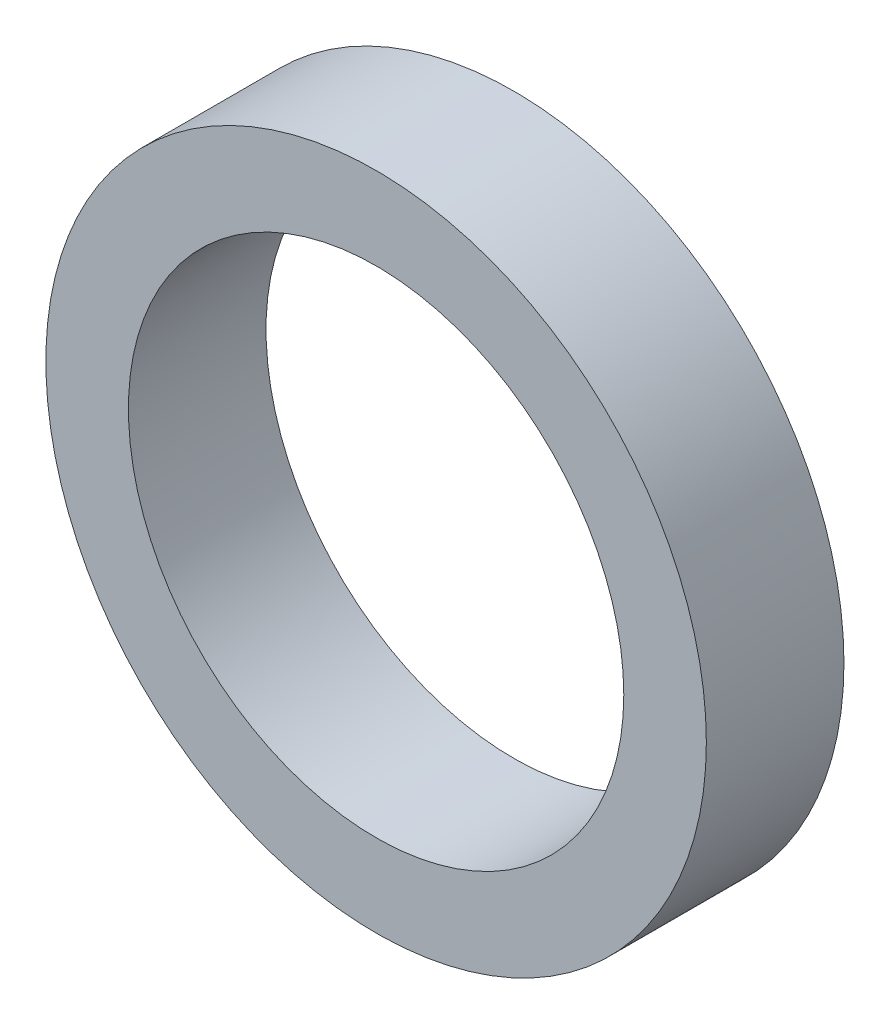
ISO-10303-21;
HEADER;
FILE_DESCRIPTION(('STEP AP214'),'2;1');
FILE_NAME('part.step','',(''),(''),'','','');
FILE_SCHEMA(('AUTOMOTIVE_DESIGN { 1 0 10303 214 1 1 1 1 }'));
ENDSEC;
DATA;
#1=APPLICATION_CONTEXT('core data for automotive mechanical design processes');
#2=APPLICATION_PROTOCOL_DEFINITION('international standard','automotive_design',2000,#1);
#3=PRODUCT_CONTEXT('',#1,'mechanical');
#4=PRODUCT('Part','Part','',(#3));
#5=PRODUCT_RELATED_PRODUCT_CATEGORY('part','',(#4));
#6=PRODUCT_DEFINITION_FORMATION('','',#4);
#7=PRODUCT_DEFINITION_CONTEXT('part definition',#1,'design');
#8=PRODUCT_DEFINITION('design','',#6,#7);
#9=PRODUCT_DEFINITION_SHAPE('','',#8);
#10=(LENGTH_UNIT() NAMED_UNIT(*) SI_UNIT(.MILLI.,.METRE.));
#11=(NAMED_UNIT(*) PLANE_ANGLE_UNIT() SI_UNIT($,.RADIAN.));
#12=(NAMED_UNIT(*) SI_UNIT($,.STERADIAN.) SOLID_ANGLE_UNIT());
#13=UNCERTAINTY_MEASURE_WITH_UNIT(LENGTH_MEASURE(1.E-05),#10,'distance_accuracy_value','');
#14=(GEOMETRIC_REPRESENTATION_CONTEXT(3) GLOBAL_UNCERTAINTY_ASSIGNED_CONTEXT((#13)) GLOBAL_UNIT_ASSIGNED_CONTEXT((#10,
#11,#12)) REPRESENTATION_CONTEXT('',''));
#15=CARTESIAN_POINT('',(0.,0.,0.));
#16=DIRECTION('',(0.,0.,1.));
#17=DIRECTION('',(1.,0.,0.));
#18=AXIS2_PLACEMENT_3D('',#15,#16,#17);
#19=CARTESIAN_POINT('',(0.,0.,5.));
#20=DIRECTION('',(0.,0.,1.));
#21=DIRECTION('',(1.,0.,0.));
#22=AXIS2_PLACEMENT_3D('',#19,#20,#21);
#23=PLANE('',#22);
#24=CARTESIAN_POINT('',(0.,0.,5.));
#25=DIRECTION('',(0.,0.,1.));
#26=DIRECTION('',(1.,0.,0.));
#27=AXIS2_PLACEMENT_3D('',#24,#25,#26);
#28=CIRCLE('',#27,12.);
#29=CARTESIAN_POINT('',(12.,0.,5.));
#30=VERTEX_POINT('',#29);
#31=EDGE_CURVE('E10',#30,#30,#28,.T.);
#32=ORIENTED_EDGE('',*,*,#31,.T.);
#33=EDGE_LOOP('',(#32));
#34=FACE_BOUND('',#33,.T.);
#35=CARTESIAN_POINT('',(0.,0.,5.));
#36=DIRECTION('',(0.,0.,1.));
#37=DIRECTION('',(1.,0.,0.));
#38=AXIS2_PLACEMENT_3D('',#35,#36,#37);
#39=CIRCLE('',#38,9.);
#40=CARTESIAN_POINT('',(9.,0.,5.));
#41=VERTEX_POINT('',#40);
#42=EDGE_CURVE('E56',#41,#41,#39,.T.);
#43=ORIENTED_EDGE('',*,*,#42,.F.);
#44=EDGE_LOOP('',(#43));
#45=FACE_BOUND('',#44,.T.);
#46=ADVANCED_FACE('F43',(#34,#45),#23,.T.);
#47=CARTESIAN_POINT('',(0.,0.,0.));
#48=DIRECTION('',(0.,0.,1.));
#49=DIRECTION('',(1.,0.,0.));
#50=AXIS2_PLACEMENT_3D('',#47,#48,#49);
#51=PLANE('',#50);
#52=CARTESIAN_POINT('',(0.,0.,0.));
#53=DIRECTION('',(0.,0.,1.));
#54=DIRECTION('',(1.,0.,0.));
#55=AXIS2_PLACEMENT_3D('',#52,#53,#54);
#56=CIRCLE('',#55,12.);
#57=CARTESIAN_POINT('',(12.,0.,0.));
#58=VERTEX_POINT('',#57);
#59=EDGE_CURVE('E47',#58,#58,#56,.T.);
#60=ORIENTED_EDGE('',*,*,#59,.F.);
#61=EDGE_LOOP('',(#60));
#62=FACE_BOUND('',#61,.T.);
#63=CARTESIAN_POINT('',(0.,0.,0.));
#64=DIRECTION('',(0.,0.,1.));
#65=DIRECTION('',(1.,0.,0.));
#66=AXIS2_PLACEMENT_3D('',#63,#64,#65);
#67=CIRCLE('',#66,9.);
#68=CARTESIAN_POINT('',(9.,0.,0.));
#69=VERTEX_POINT('',#68);
#70=EDGE_CURVE('E58',#69,#69,#67,.T.);
#71=ORIENTED_EDGE('',*,*,#70,.T.);
#72=EDGE_LOOP('',(#71));
#73=FACE_BOUND('',#72,.T.);
#74=ADVANCED_FACE('F70',(#62,#73),#51,.F.);
#75=CARTESIAN_POINT('',(0.,0.,5.));
#76=DIRECTION('',(0.,0.,-1.));
#77=DIRECTION('',(-1.,0.,0.));
#78=AXIS2_PLACEMENT_3D('',#75,#76,#77);
#79=CYLINDRICAL_SURFACE('',#78,12.);
#80=ORIENTED_EDGE('',*,*,#31,.F.);
#81=EDGE_LOOP('',(#80));
#82=FACE_BOUND('',#81,.T.);
#83=ORIENTED_EDGE('',*,*,#59,.T.);
#84=EDGE_LOOP('',(#83));
#85=FACE_BOUND('',#84,.T.);
#86=ADVANCED_FACE('F45',(#82,#85),#79,.T.);
#87=CARTESIAN_POINT('',(0.,0.,5.));
#88=DIRECTION('',(0.,0.,-1.));
#89=DIRECTION('',(-1.,0.,0.));
#90=AXIS2_PLACEMENT_3D('',#87,#88,#89);
#91=CYLINDRICAL_SURFACE('',#90,9.);
#92=ORIENTED_EDGE('',*,*,#42,.T.);
#93=EDGE_LOOP('',(#92));
#94=FACE_BOUND('',#93,.T.);
#95=ORIENTED_EDGE('',*,*,#70,.F.);
#96=EDGE_LOOP('',(#95));
#97=FACE_BOUND('',#96,.T.);
#98=ADVANCED_FACE('F66',(#94,#97),#91,.F.);
#99=CLOSED_SHELL('',(#46,#74,#86,#98));
#100=MANIFOLD_SOLID_BREP('B2',#99);
#101=ADVANCED_BREP_SHAPE_REPRESENTATION('',(#18,#100),#14);
#102=SHAPE_DEFINITION_REPRESENTATION(#9,#101);
ENDSEC;
END-ISO-10303-21;
